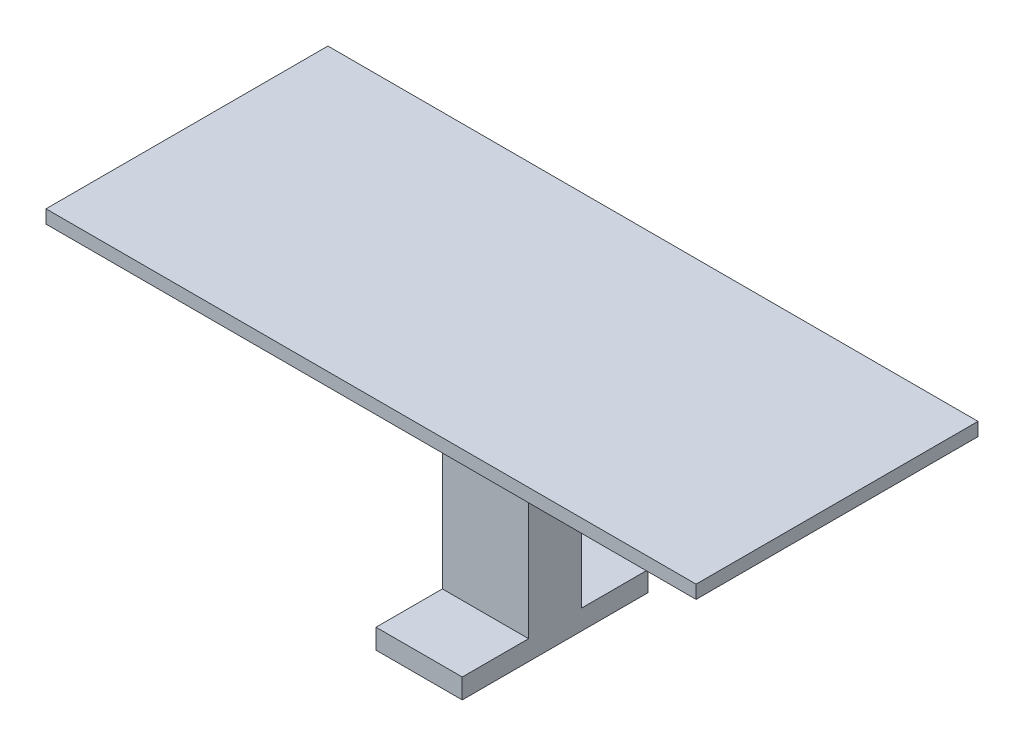
ISO-10303-21;
HEADER;
FILE_DESCRIPTION(('STEP AP214'),'2;1');
FILE_NAME('part.step','',(''),(''),'','','');
FILE_SCHEMA(('AUTOMOTIVE_DESIGN { 1 0 10303 214 1 1 1 1 }'));
ENDSEC;
DATA;
#1=APPLICATION_CONTEXT('core data for automotive mechanical design processes');
#2=APPLICATION_PROTOCOL_DEFINITION('international standard','automotive_design',2000,#1);
#3=PRODUCT_CONTEXT('',#1,'mechanical');
#4=PRODUCT('Part','Part','',(#3));
#5=PRODUCT_RELATED_PRODUCT_CATEGORY('part','',(#4));
#6=PRODUCT_DEFINITION_FORMATION('','',#4);
#7=PRODUCT_DEFINITION_CONTEXT('part definition',#1,'design');
#8=PRODUCT_DEFINITION('design','',#6,#7);
#9=PRODUCT_DEFINITION_SHAPE('','',#8);
#10=(LENGTH_UNIT() NAMED_UNIT(*) SI_UNIT(.MILLI.,.METRE.));
#11=(NAMED_UNIT(*) PLANE_ANGLE_UNIT() SI_UNIT($,.RADIAN.));
#12=(NAMED_UNIT(*) SI_UNIT($,.STERADIAN.) SOLID_ANGLE_UNIT());
#13=UNCERTAINTY_MEASURE_WITH_UNIT(LENGTH_MEASURE(1.E-05),#10,'distance_accuracy_value','');
#14=(GEOMETRIC_REPRESENTATION_CONTEXT(3) GLOBAL_UNCERTAINTY_ASSIGNED_CONTEXT((#13)) GLOBAL_UNIT_ASSIGNED_CONTEXT((#10,
#11,#12)) REPRESENTATION_CONTEXT('',''));
#15=CARTESIAN_POINT('',(0.,0.,0.));
#16=DIRECTION('',(0.,0.,1.));
#17=DIRECTION('',(1.,0.,0.));
#18=AXIS2_PLACEMENT_3D('',#15,#16,#17);
#19=CARTESIAN_POINT('',(0.,0.,0.));
#20=DIRECTION('',(0.,1.,0.));
#21=DIRECTION('',(0.,0.,1.));
#22=AXIS2_PLACEMENT_3D('',#19,#20,#21);
#23=PLANE('',#22);
#24=DIRECTION('',(0.,0.,1.));
#25=VECTOR('',#24,1.);
#26=CARTESIAN_POINT('',(-49.,0.,21.25));
#27=LINE('',#26,#25);
#28=CARTESIAN_POINT('',(-49.,0.,-21.25));
#29=VERTEX_POINT('',#28);
#30=CARTESIAN_POINT('',(-49.,0.,21.25));
#31=VERTEX_POINT('',#30);
#32=EDGE_CURVE('E200',#29,#31,#27,.T.);
#33=ORIENTED_EDGE('',*,*,#32,.F.);
#34=DIRECTION('',(-1.,0.,0.));
#35=VECTOR('',#34,1.);
#36=CARTESIAN_POINT('',(49.,0.,-21.25));
#37=LINE('',#36,#35);
#38=CARTESIAN_POINT('',(49.,0.,-21.25));
#39=VERTEX_POINT('',#38);
#40=EDGE_CURVE('E206',#39,#29,#37,.T.);
#41=ORIENTED_EDGE('',*,*,#40,.F.);
#42=DIRECTION('',(0.,0.,-1.));
#43=VECTOR('',#42,1.);
#44=CARTESIAN_POINT('',(49.,0.,21.25));
#45=LINE('',#44,#43);
#46=CARTESIAN_POINT('',(49.,0.,21.25));
#47=VERTEX_POINT('',#46);
#48=EDGE_CURVE('E222',#47,#39,#45,.T.);
#49=ORIENTED_EDGE('',*,*,#48,.F.);
#50=DIRECTION('',(1.,0.,0.));
#51=VECTOR('',#50,1.);
#52=CARTESIAN_POINT('',(49.,0.,21.25));
#53=LINE('',#52,#51);
#54=EDGE_CURVE('E219',#31,#47,#53,.T.);
#55=ORIENTED_EDGE('',*,*,#54,.F.);
#56=EDGE_LOOP('',(#33,#41,#49,#55));
#57=FACE_BOUND('',#56,.T.);
#58=DIRECTION('',(0.,0.,-1.));
#59=VECTOR('',#58,1.);
#60=CARTESIAN_POINT('',(-6.5,0.,-4.));
#61=LINE('',#60,#59);
#62=CARTESIAN_POINT('',(-6.5,0.,4.));
#63=VERTEX_POINT('',#62);
#64=CARTESIAN_POINT('',(-6.5,0.,-4.));
#65=VERTEX_POINT('',#64);
#66=EDGE_CURVE('E160',#63,#65,#61,.T.);
#67=ORIENTED_EDGE('',*,*,#66,.F.);
#68=DIRECTION('',(-1.,0.,0.));
#69=VECTOR('',#68,1.);
#70=CARTESIAN_POINT('',(6.5,0.,4.));
#71=LINE('',#70,#69);
#72=CARTESIAN_POINT('',(6.5,0.,4.));
#73=VERTEX_POINT('',#72);
#74=EDGE_CURVE('E174',#73,#63,#71,.T.);
#75=ORIENTED_EDGE('',*,*,#74,.F.);
#76=DIRECTION('',(0.,0.,1.));
#77=VECTOR('',#76,1.);
#78=CARTESIAN_POINT('',(6.5,0.,-4.));
#79=LINE('',#78,#77);
#80=CARTESIAN_POINT('',(6.5,0.,-4.));
#81=VERTEX_POINT('',#80);
#82=EDGE_CURVE('E63',#81,#73,#79,.T.);
#83=ORIENTED_EDGE('',*,*,#82,.F.);
#84=DIRECTION('',(1.,0.,0.));
#85=VECTOR('',#84,1.);
#86=CARTESIAN_POINT('',(6.5,0.,-4.));
#87=LINE('',#86,#85);
#88=EDGE_CURVE('E58',#65,#81,#87,.T.);
#89=ORIENTED_EDGE('',*,*,#88,.F.);
#90=EDGE_LOOP('',(#67,#75,#83,#89));
#91=FACE_BOUND('',#90,.T.);
#92=ADVANCED_FACE('F42',(#57,#91),#23,.F.);
#93=CARTESIAN_POINT('',(-49.,2.,21.25));
#94=DIRECTION('',(1.,0.,0.));
#95=DIRECTION('',(0.,0.,-1.));
#96=AXIS2_PLACEMENT_3D('',#93,#94,#95);
#97=PLANE('',#96);
#98=ORIENTED_EDGE('',*,*,#32,.T.);
#99=DIRECTION('',(0.,-1.,0.));
#100=VECTOR('',#99,1.);
#101=CARTESIAN_POINT('',(-49.,2.,21.25));
#102=LINE('',#101,#100);
#103=CARTESIAN_POINT('',(-49.,2.,21.25));
#104=VERTEX_POINT('',#103);
#105=EDGE_CURVE('E11',#104,#31,#102,.T.);
#106=ORIENTED_EDGE('',*,*,#105,.F.);
#107=DIRECTION('',(0.,0.,1.));
#108=VECTOR('',#107,1.);
#109=CARTESIAN_POINT('',(-49.,2.,21.25));
#110=LINE('',#109,#108);
#111=CARTESIAN_POINT('',(-49.,2.,-21.25));
#112=VERTEX_POINT('',#111);
#113=EDGE_CURVE('E201',#112,#104,#110,.T.);
#114=ORIENTED_EDGE('',*,*,#113,.F.);
#115=DIRECTION('',(0.,-1.,0.));
#116=VECTOR('',#115,1.);
#117=CARTESIAN_POINT('',(-49.,2.,-21.25));
#118=LINE('',#117,#116);
#119=EDGE_CURVE('E215',#112,#29,#118,.T.);
#120=ORIENTED_EDGE('',*,*,#119,.T.);
#121=EDGE_LOOP('',(#98,#106,#114,#120));
#122=FACE_BOUND('',#121,.T.);
#123=ADVANCED_FACE('F44',(#122),#97,.F.);
#124=CARTESIAN_POINT('',(49.,2.,21.25));
#125=DIRECTION('',(0.,0.,-1.));
#126=DIRECTION('',(-1.,0.,0.));
#127=AXIS2_PLACEMENT_3D('',#124,#125,#126);
#128=PLANE('',#127);
#129=ORIENTED_EDGE('',*,*,#54,.T.);
#130=DIRECTION('',(0.,-1.,0.));
#131=VECTOR('',#130,1.);
#132=CARTESIAN_POINT('',(49.,2.,21.25));
#133=LINE('',#132,#131);
#134=CARTESIAN_POINT('',(49.,2.,21.25));
#135=VERTEX_POINT('',#134);
#136=EDGE_CURVE('E51',#135,#47,#133,.T.);
#137=ORIENTED_EDGE('',*,*,#136,.F.);
#138=DIRECTION('',(1.,0.,0.));
#139=VECTOR('',#138,1.);
#140=CARTESIAN_POINT('',(49.,2.,21.25));
#141=LINE('',#140,#139);
#142=EDGE_CURVE('E205',#104,#135,#141,.T.);
#143=ORIENTED_EDGE('',*,*,#142,.F.);
#144=ORIENTED_EDGE('',*,*,#105,.T.);
#145=EDGE_LOOP('',(#129,#137,#143,#144));
#146=FACE_BOUND('',#145,.T.);
#147=ADVANCED_FACE('F254',(#146),#128,.F.);
#148=CARTESIAN_POINT('',(49.,2.,21.25));
#149=DIRECTION('',(-1.,0.,0.));
#150=DIRECTION('',(0.,0.,1.));
#151=AXIS2_PLACEMENT_3D('',#148,#149,#150);
#152=PLANE('',#151);
#153=ORIENTED_EDGE('',*,*,#48,.T.);
#154=DIRECTION('',(0.,-1.,0.));
#155=VECTOR('',#154,1.);
#156=CARTESIAN_POINT('',(49.,2.,-21.25));
#157=LINE('',#156,#155);
#158=CARTESIAN_POINT('',(49.,2.,-21.25));
#159=VERTEX_POINT('',#158);
#160=EDGE_CURVE('E230',#159,#39,#157,.T.);
#161=ORIENTED_EDGE('',*,*,#160,.F.);
#162=DIRECTION('',(0.,0.,-1.));
#163=VECTOR('',#162,1.);
#164=CARTESIAN_POINT('',(49.,2.,21.25));
#165=LINE('',#164,#163);
#166=EDGE_CURVE('E209',#135,#159,#165,.T.);
#167=ORIENTED_EDGE('',*,*,#166,.F.);
#168=ORIENTED_EDGE('',*,*,#136,.T.);
#169=EDGE_LOOP('',(#153,#161,#167,#168));
#170=FACE_BOUND('',#169,.T.);
#171=ADVANCED_FACE('F239',(#170),#152,.F.);
#172=CARTESIAN_POINT('',(49.,2.,-21.25));
#173=DIRECTION('',(0.,0.,1.));
#174=DIRECTION('',(1.,0.,0.));
#175=AXIS2_PLACEMENT_3D('',#172,#173,#174);
#176=PLANE('',#175);
#177=ORIENTED_EDGE('',*,*,#40,.T.);
#178=ORIENTED_EDGE('',*,*,#119,.F.);
#179=DIRECTION('',(-1.,0.,0.));
#180=VECTOR('',#179,1.);
#181=CARTESIAN_POINT('',(49.,2.,-21.25));
#182=LINE('',#181,#180);
#183=EDGE_CURVE('E212',#159,#112,#182,.T.);
#184=ORIENTED_EDGE('',*,*,#183,.F.);
#185=ORIENTED_EDGE('',*,*,#160,.T.);
#186=EDGE_LOOP('',(#177,#178,#184,#185));
#187=FACE_BOUND('',#186,.T.);
#188=ADVANCED_FACE('F247',(#187),#176,.F.);
#189=CARTESIAN_POINT('',(0.,2.,0.));
#190=DIRECTION('',(0.,1.,0.));
#191=DIRECTION('',(0.,0.,1.));
#192=AXIS2_PLACEMENT_3D('',#189,#190,#191);
#193=PLANE('',#192);
#194=ORIENTED_EDGE('',*,*,#113,.T.);
#195=ORIENTED_EDGE('',*,*,#142,.T.);
#196=ORIENTED_EDGE('',*,*,#166,.T.);
#197=ORIENTED_EDGE('',*,*,#183,.T.);
#198=EDGE_LOOP('',(#194,#195,#196,#197));
#199=FACE_BOUND('',#198,.T.);
#200=ADVANCED_FACE('F253',(#199),#193,.T.);
#201=CARTESIAN_POINT('',(-6.5,-35.,-4.));
#202=DIRECTION('',(1.,0.,0.));
#203=DIRECTION('',(0.,0.,-1.));
#204=AXIS2_PLACEMENT_3D('',#201,#202,#203);
#205=PLANE('',#204);
#206=ORIENTED_EDGE('',*,*,#66,.T.);
#207=DIRECTION('',(0.,1.,0.));
#208=VECTOR('',#207,1.);
#209=CARTESIAN_POINT('',(-6.5,-35.,-4.));
#210=LINE('',#209,#208);
#211=CARTESIAN_POINT('',(-6.5,-35.,-4.));
#212=VERTEX_POINT('',#211);
#213=EDGE_CURVE('E197',#212,#65,#210,.T.);
#214=ORIENTED_EDGE('',*,*,#213,.F.);
#215=DIRECTION('',(0.,0.,-1.));
#216=VECTOR('',#215,1.);
#217=CARTESIAN_POINT('',(-6.5,-35.,-14.));
#218=LINE('',#217,#216);
#219=CARTESIAN_POINT('',(-6.5,-35.,-14.));
#220=VERTEX_POINT('',#219);
#221=EDGE_CURVE('E157',#212,#220,#218,.T.);
#222=ORIENTED_EDGE('',*,*,#221,.T.);
#223=DIRECTION('',(0.,1.,0.));
#224=VECTOR('',#223,1.);
#225=CARTESIAN_POINT('',(-6.5,-38.,-14.));
#226=LINE('',#225,#224);
#227=CARTESIAN_POINT('',(-6.5,-38.,-14.));
#228=VERTEX_POINT('',#227);
#229=EDGE_CURVE('E134',#228,#220,#226,.T.);
#230=ORIENTED_EDGE('',*,*,#229,.F.);
#231=DIRECTION('',(0.,0.,-1.));
#232=VECTOR('',#231,1.);
#233=CARTESIAN_POINT('',(-6.5,-38.,-14.));
#234=LINE('',#233,#232);
#235=CARTESIAN_POINT('',(-6.5,-38.,14.));
#236=VERTEX_POINT('',#235);
#237=EDGE_CURVE('E141',#236,#228,#234,.T.);
#238=ORIENTED_EDGE('',*,*,#237,.F.);
#239=DIRECTION('',(0.,1.,0.));
#240=VECTOR('',#239,1.);
#241=CARTESIAN_POINT('',(-6.5,-38.,14.));
#242=LINE('',#241,#240);
#243=CARTESIAN_POINT('',(-6.5,-35.,14.));
#244=VERTEX_POINT('',#243);
#245=EDGE_CURVE('E441',#236,#244,#242,.T.);
#246=ORIENTED_EDGE('',*,*,#245,.T.);
#247=CARTESIAN_POINT('',(-6.5,-35.,4.));
#248=VERTEX_POINT('',#247);
#249=EDGE_CURVE('E435',#244,#248,#218,.T.);
#250=ORIENTED_EDGE('',*,*,#249,.T.);
#251=DIRECTION('',(0.,1.,0.));
#252=VECTOR('',#251,1.);
#253=CARTESIAN_POINT('',(-6.5,-35.,4.));
#254=LINE('',#253,#252);
#255=EDGE_CURVE('E177',#248,#63,#254,.T.);
#256=ORIENTED_EDGE('',*,*,#255,.T.);
#257=EDGE_LOOP('',(#206,#214,#222,#230,#238,#246,#250,#256));
#258=FACE_BOUND('',#257,.T.);
#259=ADVANCED_FACE('F154',(#258),#205,.F.);
#260=CARTESIAN_POINT('',(6.5,-35.,-4.));
#261=DIRECTION('',(0.,0.,1.));
#262=DIRECTION('',(1.,0.,0.));
#263=AXIS2_PLACEMENT_3D('',#260,#261,#262);
#264=PLANE('',#263);
#265=ORIENTED_EDGE('',*,*,#88,.T.);
#266=DIRECTION('',(0.,1.,0.));
#267=VECTOR('',#266,1.);
#268=CARTESIAN_POINT('',(6.5,-35.,-4.));
#269=LINE('',#268,#267);
#270=CARTESIAN_POINT('',(6.5,-35.,-4.));
#271=VERTEX_POINT('',#270);
#272=EDGE_CURVE('E193',#271,#81,#269,.T.);
#273=ORIENTED_EDGE('',*,*,#272,.F.);
#274=DIRECTION('',(1.,0.,0.));
#275=VECTOR('',#274,1.);
#276=CARTESIAN_POINT('',(6.5,-35.,-4.));
#277=LINE('',#276,#275);
#278=EDGE_CURVE('E169',#212,#271,#277,.T.);
#279=ORIENTED_EDGE('',*,*,#278,.F.);
#280=ORIENTED_EDGE('',*,*,#213,.T.);
#281=EDGE_LOOP('',(#265,#273,#279,#280));
#282=FACE_BOUND('',#281,.T.);
#283=ADVANCED_FACE('F275',(#282),#264,.F.);
#284=CARTESIAN_POINT('',(6.5,-35.,-4.));
#285=DIRECTION('',(-1.,0.,0.));
#286=DIRECTION('',(0.,0.,1.));
#287=AXIS2_PLACEMENT_3D('',#284,#285,#286);
#288=PLANE('',#287);
#289=ORIENTED_EDGE('',*,*,#82,.T.);
#290=DIRECTION('',(0.,1.,0.));
#291=VECTOR('',#290,1.);
#292=CARTESIAN_POINT('',(6.5,-35.,4.));
#293=LINE('',#292,#291);
#294=CARTESIAN_POINT('',(6.5,-35.,4.));
#295=VERTEX_POINT('',#294);
#296=EDGE_CURVE('E189',#295,#73,#293,.T.);
#297=ORIENTED_EDGE('',*,*,#296,.F.);
#298=DIRECTION('',(0.,0.,1.));
#299=VECTOR('',#298,1.);
#300=CARTESIAN_POINT('',(6.5,-35.,-14.));
#301=LINE('',#300,#299);
#302=CARTESIAN_POINT('',(6.5,-35.,14.));
#303=VERTEX_POINT('',#302);
#304=EDGE_CURVE('E422',#295,#303,#301,.T.);
#305=ORIENTED_EDGE('',*,*,#304,.T.);
#306=DIRECTION('',(0.,1.,0.));
#307=VECTOR('',#306,1.);
#308=CARTESIAN_POINT('',(6.5,-38.,14.));
#309=LINE('',#308,#307);
#310=CARTESIAN_POINT('',(6.5,-38.,14.));
#311=VERTEX_POINT('',#310);
#312=EDGE_CURVE('E165',#311,#303,#309,.T.);
#313=ORIENTED_EDGE('',*,*,#312,.F.);
#314=DIRECTION('',(0.,0.,1.));
#315=VECTOR('',#314,1.);
#316=CARTESIAN_POINT('',(6.5,-38.,-14.));
#317=LINE('',#316,#315);
#318=CARTESIAN_POINT('',(6.5,-38.,-14.));
#319=VERTEX_POINT('',#318);
#320=EDGE_CURVE('E140',#319,#311,#317,.T.);
#321=ORIENTED_EDGE('',*,*,#320,.F.);
#322=DIRECTION('',(0.,1.,0.));
#323=VECTOR('',#322,1.);
#324=CARTESIAN_POINT('',(6.5,-38.,-14.));
#325=LINE('',#324,#323);
#326=CARTESIAN_POINT('',(6.5,-35.,-14.));
#327=VERTEX_POINT('',#326);
#328=EDGE_CURVE('E136',#319,#327,#325,.T.);
#329=ORIENTED_EDGE('',*,*,#328,.T.);
#330=EDGE_CURVE('E429',#327,#271,#301,.T.);
#331=ORIENTED_EDGE('',*,*,#330,.T.);
#332=ORIENTED_EDGE('',*,*,#272,.T.);
#333=EDGE_LOOP('',(#289,#297,#305,#313,#321,#329,#331,#332));
#334=FACE_BOUND('',#333,.T.);
#335=ADVANCED_FACE('F279',(#334),#288,.F.);
#336=CARTESIAN_POINT('',(6.5,-35.,4.));
#337=DIRECTION('',(0.,0.,-1.));
#338=DIRECTION('',(-1.,0.,0.));
#339=AXIS2_PLACEMENT_3D('',#336,#337,#338);
#340=PLANE('',#339);
#341=ORIENTED_EDGE('',*,*,#74,.T.);
#342=ORIENTED_EDGE('',*,*,#255,.F.);
#343=DIRECTION('',(-1.,0.,0.));
#344=VECTOR('',#343,1.);
#345=CARTESIAN_POINT('',(6.5,-35.,4.));
#346=LINE('',#345,#344);
#347=EDGE_CURVE('E173',#295,#248,#346,.T.);
#348=ORIENTED_EDGE('',*,*,#347,.F.);
#349=ORIENTED_EDGE('',*,*,#296,.T.);
#350=EDGE_LOOP('',(#341,#342,#348,#349));
#351=FACE_BOUND('',#350,.T.);
#352=ADVANCED_FACE('F285',(#351),#340,.F.);
#353=CARTESIAN_POINT('',(0.,-35.,0.));
#354=DIRECTION('',(0.,-1.,0.));
#355=DIRECTION('',(0.,0.,-1.));
#356=AXIS2_PLACEMENT_3D('',#353,#354,#355);
#357=PLANE('',#356);
#358=ORIENTED_EDGE('',*,*,#221,.F.);
#359=ORIENTED_EDGE('',*,*,#278,.T.);
#360=ORIENTED_EDGE('',*,*,#330,.F.);
#361=DIRECTION('',(1.,0.,0.));
#362=VECTOR('',#361,1.);
#363=CARTESIAN_POINT('',(6.5,-35.,-14.));
#364=LINE('',#363,#362);
#365=EDGE_CURVE('E430',#220,#327,#364,.T.);
#366=ORIENTED_EDGE('',*,*,#365,.F.);
#367=EDGE_LOOP('',(#358,#359,#360,#366));
#368=FACE_BOUND('',#367,.T.);
#369=ADVANCED_FACE('F289',(#368),#357,.F.);
#370=ORIENTED_EDGE('',*,*,#304,.F.);
#371=ORIENTED_EDGE('',*,*,#347,.T.);
#372=ORIENTED_EDGE('',*,*,#249,.F.);
#373=DIRECTION('',(-1.,0.,0.));
#374=VECTOR('',#373,1.);
#375=CARTESIAN_POINT('',(6.5,-35.,14.));
#376=LINE('',#375,#374);
#377=EDGE_CURVE('E151',#303,#244,#376,.T.);
#378=ORIENTED_EDGE('',*,*,#377,.F.);
#379=EDGE_LOOP('',(#370,#371,#372,#378));
#380=FACE_BOUND('',#379,.T.);
#381=ADVANCED_FACE('F294',(#380),#357,.F.);
#382=CARTESIAN_POINT('',(6.5,-38.,-14.));
#383=DIRECTION('',(0.,0.,1.));
#384=DIRECTION('',(1.,0.,0.));
#385=AXIS2_PLACEMENT_3D('',#382,#383,#384);
#386=PLANE('',#385);
#387=ORIENTED_EDGE('',*,*,#365,.T.);
#388=ORIENTED_EDGE('',*,*,#328,.F.);
#389=DIRECTION('',(1.,0.,0.));
#390=VECTOR('',#389,1.);
#391=CARTESIAN_POINT('',(6.5,-38.,-14.));
#392=LINE('',#391,#390);
#393=EDGE_CURVE('E130',#228,#319,#392,.T.);
#394=ORIENTED_EDGE('',*,*,#393,.F.);
#395=ORIENTED_EDGE('',*,*,#229,.T.);
#396=EDGE_LOOP('',(#387,#388,#394,#395));
#397=FACE_BOUND('',#396,.T.);
#398=ADVANCED_FACE('F132',(#397),#386,.F.);
#399=CARTESIAN_POINT('',(6.5,-38.,14.));
#400=DIRECTION('',(0.,0.,-1.));
#401=DIRECTION('',(-1.,0.,0.));
#402=AXIS2_PLACEMENT_3D('',#399,#400,#401);
#403=PLANE('',#402);
#404=ORIENTED_EDGE('',*,*,#377,.T.);
#405=ORIENTED_EDGE('',*,*,#245,.F.);
#406=DIRECTION('',(-1.,0.,0.));
#407=VECTOR('',#406,1.);
#408=CARTESIAN_POINT('',(6.5,-38.,14.));
#409=LINE('',#408,#407);
#410=EDGE_CURVE('E146',#311,#236,#409,.T.);
#411=ORIENTED_EDGE('',*,*,#410,.F.);
#412=ORIENTED_EDGE('',*,*,#312,.T.);
#413=EDGE_LOOP('',(#404,#405,#411,#412));
#414=FACE_BOUND('',#413,.T.);
#415=ADVANCED_FACE('F293',(#414),#403,.F.);
#416=CARTESIAN_POINT('',(0.,-38.,0.));
#417=DIRECTION('',(0.,-1.,0.));
#418=DIRECTION('',(0.,0.,-1.));
#419=AXIS2_PLACEMENT_3D('',#416,#417,#418);
#420=PLANE('',#419);
#421=ORIENTED_EDGE('',*,*,#237,.T.);
#422=ORIENTED_EDGE('',*,*,#393,.T.);
#423=ORIENTED_EDGE('',*,*,#320,.T.);
#424=ORIENTED_EDGE('',*,*,#410,.T.);
#425=EDGE_LOOP('',(#421,#422,#423,#424));
#426=FACE_BOUND('',#425,.T.);
#427=ADVANCED_FACE('F144',(#426),#420,.T.);
#428=CLOSED_SHELL('',(#92,#123,#147,#171,#188,#200,#259,#283,#335,#352,#369,#381,#398,#415,#427));
#429=MANIFOLD_SOLID_BREP('B2',#428);
#430=ADVANCED_BREP_SHAPE_REPRESENTATION('',(#18,#429),#14);
#431=SHAPE_DEFINITION_REPRESENTATION(#9,#430);
ENDSEC;
END-ISO-10303-21;
